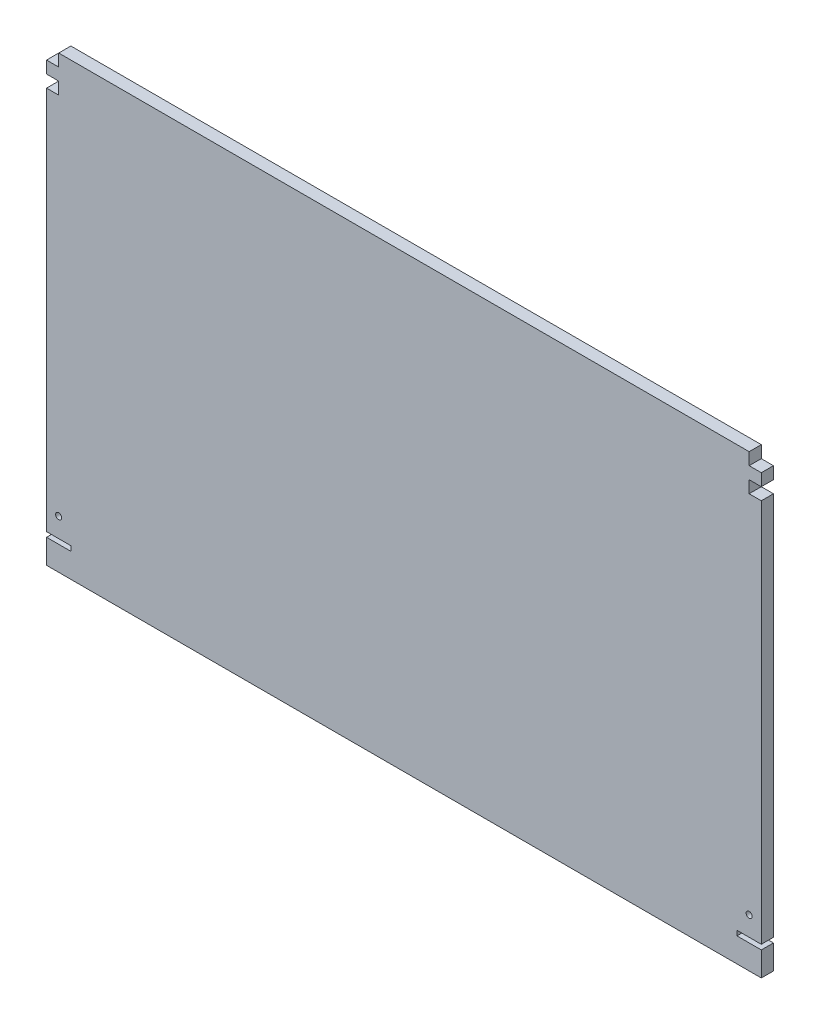
ISO-10303-21;
HEADER;
FILE_DESCRIPTION(('STEP AP214'),'2;1');
FILE_NAME('part.step','',(''),(''),'','','');
FILE_SCHEMA(('AUTOMOTIVE_DESIGN { 1 0 10303 214 1 1 1 1 }'));
ENDSEC;
DATA;
#1=APPLICATION_CONTEXT('core data for automotive mechanical design processes');
#2=APPLICATION_PROTOCOL_DEFINITION('international standard','automotive_design',2000,#1);
#3=PRODUCT_CONTEXT('',#1,'mechanical');
#4=PRODUCT('Part','Part','',(#3));
#5=PRODUCT_RELATED_PRODUCT_CATEGORY('part','',(#4));
#6=PRODUCT_DEFINITION_FORMATION('','',#4);
#7=PRODUCT_DEFINITION_CONTEXT('part definition',#1,'design');
#8=PRODUCT_DEFINITION('design','',#6,#7);
#9=PRODUCT_DEFINITION_SHAPE('','',#8);
#10=(LENGTH_UNIT() NAMED_UNIT(*) SI_UNIT(.MILLI.,.METRE.));
#11=(NAMED_UNIT(*) PLANE_ANGLE_UNIT() SI_UNIT($,.RADIAN.));
#12=(NAMED_UNIT(*) SI_UNIT($,.STERADIAN.) SOLID_ANGLE_UNIT());
#13=UNCERTAINTY_MEASURE_WITH_UNIT(LENGTH_MEASURE(1.E-05),#10,'distance_accuracy_value','');
#14=(GEOMETRIC_REPRESENTATION_CONTEXT(3) GLOBAL_UNCERTAINTY_ASSIGNED_CONTEXT((#13)) GLOBAL_UNIT_ASSIGNED_CONTEXT((#10,
#11,#12)) REPRESENTATION_CONTEXT('',''));
#15=CARTESIAN_POINT('',(0.,0.,0.));
#16=DIRECTION('',(0.,0.,1.));
#17=DIRECTION('',(1.,0.,0.));
#18=AXIS2_PLACEMENT_3D('',#15,#16,#17);
#19=CARTESIAN_POINT('',(-294.,0.,5.));
#20=DIRECTION('',(1.,0.,0.));
#21=DIRECTION('',(0.,0.,-1.));
#22=AXIS2_PLACEMENT_3D('',#19,#20,#21);
#23=PLANE('',#22);
#24=DIRECTION('',(0.,-1.,0.));
#25=VECTOR('',#24,1.);
#26=CARTESIAN_POINT('',(-294.,0.,5.));
#27=LINE('',#26,#25);
#28=CARTESIAN_POINT('',(-294.,-175.,5.));
#29=VERTEX_POINT('',#28);
#30=CARTESIAN_POINT('',(-294.,-185.,5.));
#31=VERTEX_POINT('',#30);
#32=EDGE_CURVE('E216',#29,#31,#27,.T.);
#33=ORIENTED_EDGE('',*,*,#32,.F.);
#34=DIRECTION('',(0.,0.,-1.));
#35=VECTOR('',#34,1.);
#36=CARTESIAN_POINT('',(-294.,-175.,5.));
#37=LINE('',#36,#35);
#38=CARTESIAN_POINT('',(-294.,-175.,0.));
#39=VERTEX_POINT('',#38);
#40=EDGE_CURVE('E266',#29,#39,#37,.T.);
#41=ORIENTED_EDGE('',*,*,#40,.T.);
#42=DIRECTION('',(0.,-1.,0.));
#43=VECTOR('',#42,1.);
#44=CARTESIAN_POINT('',(-294.,0.,0.));
#45=LINE('',#44,#43);
#46=CARTESIAN_POINT('',(-294.,-185.,0.));
#47=VERTEX_POINT('',#46);
#48=EDGE_CURVE('E308',#39,#47,#45,.T.);
#49=ORIENTED_EDGE('',*,*,#48,.T.);
#50=DIRECTION('',(0.,0.,-1.));
#51=VECTOR('',#50,1.);
#52=CARTESIAN_POINT('',(-294.,-185.,5.));
#53=LINE('',#52,#51);
#54=EDGE_CURVE('E370',#31,#47,#53,.T.);
#55=ORIENTED_EDGE('',*,*,#54,.F.);
#56=EDGE_LOOP('',(#33,#41,#49,#55));
#57=FACE_BOUND('',#56,.T.);
#58=ADVANCED_FACE('F32',(#57),#23,.F.);
#59=CARTESIAN_POINT('',(0.,0.,5.));
#60=DIRECTION('',(1.,0.,0.));
#61=DIRECTION('',(0.,0.,-1.));
#62=AXIS2_PLACEMENT_3D('',#59,#60,#61);
#63=PLANE('',#62);
#64=DIRECTION('',(0.,0.,-1.));
#65=VECTOR('',#64,1.);
#66=CARTESIAN_POINT('',(0.,-175.,5.));
#67=LINE('',#66,#65);
#68=CARTESIAN_POINT('',(0.,-175.,5.));
#69=VERTEX_POINT('',#68);
#70=CARTESIAN_POINT('',(0.,-175.,0.));
#71=VERTEX_POINT('',#70);
#72=EDGE_CURVE('E245',#69,#71,#67,.T.);
#73=ORIENTED_EDGE('',*,*,#72,.F.);
#74=DIRECTION('',(0.,-1.,0.));
#75=VECTOR('',#74,1.);
#76=CARTESIAN_POINT('',(0.,0.,5.));
#77=LINE('',#76,#75);
#78=CARTESIAN_POINT('',(0.,-185.,5.));
#79=VERTEX_POINT('',#78);
#80=EDGE_CURVE('E220',#69,#79,#77,.T.);
#81=ORIENTED_EDGE('',*,*,#80,.T.);
#82=DIRECTION('',(0.,0.,-1.));
#83=VECTOR('',#82,1.);
#84=CARTESIAN_POINT('',(0.,-185.,5.));
#85=LINE('',#84,#83);
#86=CARTESIAN_POINT('',(0.,-185.,0.));
#87=VERTEX_POINT('',#86);
#88=EDGE_CURVE('E372',#79,#87,#85,.T.);
#89=ORIENTED_EDGE('',*,*,#88,.T.);
#90=DIRECTION('',(0.,-1.,0.));
#91=VECTOR('',#90,1.);
#92=CARTESIAN_POINT('',(0.,0.,0.));
#93=LINE('',#92,#91);
#94=EDGE_CURVE('E382',#71,#87,#93,.T.);
#95=ORIENTED_EDGE('',*,*,#94,.F.);
#96=EDGE_LOOP('',(#73,#81,#89,#95));
#97=FACE_BOUND('',#96,.T.);
#98=ADVANCED_FACE('F425',(#97),#63,.T.);
#99=CARTESIAN_POINT('',(0.,-4.99999999999998,5.));
#100=DIRECTION('',(0.,1.,0.));
#101=DIRECTION('',(0.,0.,1.));
#102=AXIS2_PLACEMENT_3D('',#99,#100,#101);
#103=PLANE('',#102);
#104=DIRECTION('',(1.,0.,0.));
#105=VECTOR('',#104,1.);
#106=CARTESIAN_POINT('',(0.,-4.99999999999998,0.));
#107=LINE('',#106,#105);
#108=CARTESIAN_POINT('',(-294.,-4.99999999999998,0.));
#109=VERTEX_POINT('',#108);
#110=CARTESIAN_POINT('',(-289.,-4.99999999999998,0.));
#111=VERTEX_POINT('',#110);
#112=EDGE_CURVE('E269',#109,#111,#107,.T.);
#113=ORIENTED_EDGE('',*,*,#112,.F.);
#114=DIRECTION('',(0.,0.,-1.));
#115=VECTOR('',#114,1.);
#116=CARTESIAN_POINT('',(-294.,-4.99999999999998,5.));
#117=LINE('',#116,#115);
#118=CARTESIAN_POINT('',(-294.,-4.99999999999998,5.));
#119=VERTEX_POINT('',#118);
#120=EDGE_CURVE('E11',#119,#109,#117,.T.);
#121=ORIENTED_EDGE('',*,*,#120,.F.);
#122=DIRECTION('',(1.,0.,0.));
#123=VECTOR('',#122,1.);
#124=CARTESIAN_POINT('',(0.,-4.99999999999998,5.));
#125=LINE('',#124,#123);
#126=CARTESIAN_POINT('',(-289.,-4.99999999999998,5.));
#127=VERTEX_POINT('',#126);
#128=EDGE_CURVE('E225',#119,#127,#125,.T.);
#129=ORIENTED_EDGE('',*,*,#128,.T.);
#130=DIRECTION('',(0.,0.,-1.));
#131=VECTOR('',#130,1.);
#132=CARTESIAN_POINT('',(-289.,-4.99999999999998,5.));
#133=LINE('',#132,#131);
#134=EDGE_CURVE('E333',#127,#111,#133,.T.);
#135=ORIENTED_EDGE('',*,*,#134,.T.);
#136=EDGE_LOOP('',(#113,#121,#129,#135));
#137=FACE_BOUND('',#136,.T.);
#138=ADVANCED_FACE('F34',(#137),#103,.T.);
#139=CARTESIAN_POINT('',(-294.,-9.99999999999998,0.));
#140=VERTEX_POINT('',#139);
#141=EDGE_CURVE('E317',#109,#140,#45,.T.);
#142=ORIENTED_EDGE('',*,*,#141,.T.);
#143=DIRECTION('',(0.,0.,-1.));
#144=VECTOR('',#143,1.);
#145=CARTESIAN_POINT('',(-294.,-9.99999999999998,5.));
#146=LINE('',#145,#144);
#147=CARTESIAN_POINT('',(-294.,-9.99999999999998,5.));
#148=VERTEX_POINT('',#147);
#149=EDGE_CURVE('E40',#148,#140,#146,.T.);
#150=ORIENTED_EDGE('',*,*,#149,.F.);
#151=EDGE_CURVE('E218',#119,#148,#27,.T.);
#152=ORIENTED_EDGE('',*,*,#151,.F.);
#153=ORIENTED_EDGE('',*,*,#120,.T.);
#154=EDGE_LOOP('',(#142,#150,#152,#153));
#155=FACE_BOUND('',#154,.T.);
#156=ADVANCED_FACE('F447',(#155),#23,.F.);
#157=CARTESIAN_POINT('',(0.,-9.99999999999998,5.));
#158=DIRECTION('',(0.,1.,0.));
#159=DIRECTION('',(0.,0.,1.));
#160=AXIS2_PLACEMENT_3D('',#157,#158,#159);
#161=PLANE('',#160);
#162=DIRECTION('',(1.,0.,0.));
#163=VECTOR('',#162,1.);
#164=CARTESIAN_POINT('',(0.,-9.99999999999998,0.));
#165=LINE('',#164,#163);
#166=CARTESIAN_POINT('',(-289.,-9.99999999999998,0.));
#167=VERTEX_POINT('',#166);
#168=EDGE_CURVE('E323',#140,#167,#165,.T.);
#169=ORIENTED_EDGE('',*,*,#168,.T.);
#170=DIRECTION('',(0.,0.,-1.));
#171=VECTOR('',#170,1.);
#172=CARTESIAN_POINT('',(-289.,-9.99999999999998,5.));
#173=LINE('',#172,#171);
#174=CARTESIAN_POINT('',(-289.,-9.99999999999998,5.));
#175=VERTEX_POINT('',#174);
#176=EDGE_CURVE('E366',#175,#167,#173,.T.);
#177=ORIENTED_EDGE('',*,*,#176,.F.);
#178=DIRECTION('',(1.,0.,0.));
#179=VECTOR('',#178,1.);
#180=CARTESIAN_POINT('',(0.,-9.99999999999998,5.));
#181=LINE('',#180,#179);
#182=EDGE_CURVE('E224',#148,#175,#181,.T.);
#183=ORIENTED_EDGE('',*,*,#182,.F.);
#184=ORIENTED_EDGE('',*,*,#149,.T.);
#185=EDGE_LOOP('',(#169,#177,#183,#184));
#186=FACE_BOUND('',#185,.T.);
#187=ADVANCED_FACE('F378',(#186),#161,.F.);
#188=CARTESIAN_POINT('',(-289.,0.,5.));
#189=DIRECTION('',(1.,0.,0.));
#190=DIRECTION('',(0.,0.,-1.));
#191=AXIS2_PLACEMENT_3D('',#188,#189,#190);
#192=PLANE('',#191);
#193=DIRECTION('',(0.,-1.,0.));
#194=VECTOR('',#193,1.);
#195=CARTESIAN_POINT('',(-289.,0.,0.));
#196=LINE('',#195,#194);
#197=CARTESIAN_POINT('',(-289.,-15.,0.));
#198=VERTEX_POINT('',#197);
#199=EDGE_CURVE('E319',#167,#198,#196,.T.);
#200=ORIENTED_EDGE('',*,*,#199,.T.);
#201=DIRECTION('',(0.,0.,-1.));
#202=VECTOR('',#201,1.);
#203=CARTESIAN_POINT('',(-289.,-15.,5.));
#204=LINE('',#203,#202);
#205=CARTESIAN_POINT('',(-289.,-15.,5.));
#206=VERTEX_POINT('',#205);
#207=EDGE_CURVE('E361',#206,#198,#204,.T.);
#208=ORIENTED_EDGE('',*,*,#207,.F.);
#209=DIRECTION('',(0.,-1.,0.));
#210=VECTOR('',#209,1.);
#211=CARTESIAN_POINT('',(-289.,0.,5.));
#212=LINE('',#211,#210);
#213=EDGE_CURVE('E229',#175,#206,#212,.T.);
#214=ORIENTED_EDGE('',*,*,#213,.F.);
#215=ORIENTED_EDGE('',*,*,#176,.T.);
#216=EDGE_LOOP('',(#200,#208,#214,#215));
#217=FACE_BOUND('',#216,.T.);
#218=ADVANCED_FACE('F362',(#217),#192,.F.);
#219=CARTESIAN_POINT('',(0.,-15.,5.));
#220=DIRECTION('',(0.,1.,0.));
#221=DIRECTION('',(0.,0.,1.));
#222=AXIS2_PLACEMENT_3D('',#219,#220,#221);
#223=PLANE('',#222);
#224=DIRECTION('',(1.,0.,0.));
#225=VECTOR('',#224,1.);
#226=CARTESIAN_POINT('',(0.,-15.,0.));
#227=LINE('',#226,#225);
#228=CARTESIAN_POINT('',(-294.,-15.,0.));
#229=VERTEX_POINT('',#228);
#230=EDGE_CURVE('E315',#229,#198,#227,.T.);
#231=ORIENTED_EDGE('',*,*,#230,.F.);
#232=DIRECTION('',(0.,0.,-1.));
#233=VECTOR('',#232,1.);
#234=CARTESIAN_POINT('',(-294.,-15.,5.));
#235=LINE('',#234,#233);
#236=CARTESIAN_POINT('',(-294.,-15.,5.));
#237=VERTEX_POINT('',#236);
#238=EDGE_CURVE('E367',#237,#229,#235,.T.);
#239=ORIENTED_EDGE('',*,*,#238,.F.);
#240=DIRECTION('',(1.,0.,0.));
#241=VECTOR('',#240,1.);
#242=CARTESIAN_POINT('',(0.,-15.,5.));
#243=LINE('',#242,#241);
#244=EDGE_CURVE('E214',#237,#206,#243,.T.);
#245=ORIENTED_EDGE('',*,*,#244,.T.);
#246=ORIENTED_EDGE('',*,*,#207,.T.);
#247=EDGE_LOOP('',(#231,#239,#245,#246));
#248=FACE_BOUND('',#247,.T.);
#249=ADVANCED_FACE('F369',(#248),#223,.T.);
#250=CARTESIAN_POINT('',(-294.,-173.,0.));
#251=VERTEX_POINT('',#250);
#252=EDGE_CURVE('E208',#229,#251,#45,.T.);
#253=ORIENTED_EDGE('',*,*,#252,.T.);
#254=DIRECTION('',(0.,0.,-1.));
#255=VECTOR('',#254,1.);
#256=CARTESIAN_POINT('',(-294.,-173.,5.));
#257=LINE('',#256,#255);
#258=CARTESIAN_POINT('',(-294.,-173.,5.));
#259=VERTEX_POINT('',#258);
#260=EDGE_CURVE('E55',#259,#251,#257,.T.);
#261=ORIENTED_EDGE('',*,*,#260,.F.);
#262=EDGE_CURVE('E205',#237,#259,#27,.T.);
#263=ORIENTED_EDGE('',*,*,#262,.F.);
#264=ORIENTED_EDGE('',*,*,#238,.T.);
#265=EDGE_LOOP('',(#253,#261,#263,#264));
#266=FACE_BOUND('',#265,.T.);
#267=ADVANCED_FACE('F204',(#266),#23,.F.);
#268=CARTESIAN_POINT('',(0.,-185.,5.));
#269=DIRECTION('',(0.,-1.,0.));
#270=DIRECTION('',(0.,0.,-1.));
#271=AXIS2_PLACEMENT_3D('',#268,#269,#270);
#272=PLANE('',#271);
#273=DIRECTION('',(-1.,0.,0.));
#274=VECTOR('',#273,1.);
#275=CARTESIAN_POINT('',(0.,-185.,0.));
#276=LINE('',#275,#274);
#277=EDGE_CURVE('E311',#87,#47,#276,.T.);
#278=ORIENTED_EDGE('',*,*,#277,.F.);
#279=ORIENTED_EDGE('',*,*,#88,.F.);
#280=DIRECTION('',(-1.,0.,0.));
#281=VECTOR('',#280,1.);
#282=CARTESIAN_POINT('',(0.,-185.,5.));
#283=LINE('',#282,#281);
#284=EDGE_CURVE('E215',#79,#31,#283,.T.);
#285=ORIENTED_EDGE('',*,*,#284,.T.);
#286=ORIENTED_EDGE('',*,*,#54,.T.);
#287=EDGE_LOOP('',(#278,#279,#285,#286));
#288=FACE_BOUND('',#287,.T.);
#289=ADVANCED_FACE('F429',(#288),#272,.T.);
#290=DIRECTION('',(0.,0.,-1.));
#291=VECTOR('',#290,1.);
#292=CARTESIAN_POINT('',(0.,-173.,5.));
#293=LINE('',#292,#291);
#294=CARTESIAN_POINT('',(0.,-173.,5.));
#295=VERTEX_POINT('',#294);
#296=CARTESIAN_POINT('',(0.,-173.,0.));
#297=VERTEX_POINT('',#296);
#298=EDGE_CURVE('E242',#295,#297,#293,.T.);
#299=ORIENTED_EDGE('',*,*,#298,.T.);
#300=CARTESIAN_POINT('',(0.,-15.,0.));
#301=VERTEX_POINT('',#300);
#302=EDGE_CURVE('E383',#301,#297,#93,.T.);
#303=ORIENTED_EDGE('',*,*,#302,.F.);
#304=DIRECTION('',(0.,0.,-1.));
#305=VECTOR('',#304,1.);
#306=CARTESIAN_POINT('',(0.,-15.,5.));
#307=LINE('',#306,#305);
#308=CARTESIAN_POINT('',(0.,-15.,5.));
#309=VERTEX_POINT('',#308);
#310=EDGE_CURVE('E419',#309,#301,#307,.T.);
#311=ORIENTED_EDGE('',*,*,#310,.F.);
#312=EDGE_CURVE('E350',#309,#295,#77,.T.);
#313=ORIENTED_EDGE('',*,*,#312,.T.);
#314=EDGE_LOOP('',(#299,#303,#311,#313));
#315=FACE_BOUND('',#314,.T.);
#316=ADVANCED_FACE('F452',(#315),#63,.T.);
#317=CARTESIAN_POINT('',(0.,-15.,5.));
#318=DIRECTION('',(0.,-1.,0.));
#319=DIRECTION('',(0.,0.,-1.));
#320=AXIS2_PLACEMENT_3D('',#317,#318,#319);
#321=PLANE('',#320);
#322=DIRECTION('',(-1.,0.,0.));
#323=VECTOR('',#322,1.);
#324=CARTESIAN_POINT('',(0.,-15.,0.));
#325=LINE('',#324,#323);
#326=CARTESIAN_POINT('',(-5.,-15.,0.));
#327=VERTEX_POINT('',#326);
#328=EDGE_CURVE('E386',#301,#327,#325,.T.);
#329=ORIENTED_EDGE('',*,*,#328,.T.);
#330=DIRECTION('',(0.,0.,-1.));
#331=VECTOR('',#330,1.);
#332=CARTESIAN_POINT('',(-5.,-15.,5.));
#333=LINE('',#332,#331);
#334=CARTESIAN_POINT('',(-5.,-15.,5.));
#335=VERTEX_POINT('',#334);
#336=EDGE_CURVE('E417',#335,#327,#333,.T.);
#337=ORIENTED_EDGE('',*,*,#336,.F.);
#338=DIRECTION('',(-1.,0.,0.));
#339=VECTOR('',#338,1.);
#340=CARTESIAN_POINT('',(0.,-15.,5.));
#341=LINE('',#340,#339);
#342=EDGE_CURVE('E348',#309,#335,#341,.T.);
#343=ORIENTED_EDGE('',*,*,#342,.F.);
#344=ORIENTED_EDGE('',*,*,#310,.T.);
#345=EDGE_LOOP('',(#329,#337,#343,#344));
#346=FACE_BOUND('',#345,.T.);
#347=ADVANCED_FACE('F494',(#346),#321,.F.);
#348=CARTESIAN_POINT('',(-5.,0.,5.));
#349=DIRECTION('',(1.,0.,0.));
#350=DIRECTION('',(0.,1.,0.));
#351=AXIS2_PLACEMENT_3D('',#348,#349,#350);
#352=PLANE('',#351);
#353=DIRECTION('',(0.,-1.,0.));
#354=VECTOR('',#353,1.);
#355=CARTESIAN_POINT('',(-5.,0.,0.));
#356=LINE('',#355,#354);
#357=CARTESIAN_POINT('',(-5.,-9.99999999999998,0.));
#358=VERTEX_POINT('',#357);
#359=EDGE_CURVE('E390',#358,#327,#356,.T.);
#360=ORIENTED_EDGE('',*,*,#359,.F.);
#361=DIRECTION('',(0.,0.,-1.));
#362=VECTOR('',#361,1.);
#363=CARTESIAN_POINT('',(-5.,-9.99999999999998,5.));
#364=LINE('',#363,#362);
#365=CARTESIAN_POINT('',(-5.,-9.99999999999998,5.));
#366=VERTEX_POINT('',#365);
#367=EDGE_CURVE('E415',#366,#358,#364,.T.);
#368=ORIENTED_EDGE('',*,*,#367,.F.);
#369=DIRECTION('',(0.,-1.,0.));
#370=VECTOR('',#369,1.);
#371=CARTESIAN_POINT('',(-5.,0.,5.));
#372=LINE('',#371,#370);
#373=EDGE_CURVE('E345',#366,#335,#372,.T.);
#374=ORIENTED_EDGE('',*,*,#373,.T.);
#375=ORIENTED_EDGE('',*,*,#336,.T.);
#376=EDGE_LOOP('',(#360,#368,#374,#375));
#377=FACE_BOUND('',#376,.T.);
#378=ADVANCED_FACE('F499',(#377),#352,.T.);
#379=CARTESIAN_POINT('',(0.,-9.99999999999998,5.));
#380=DIRECTION('',(0.,-1.,0.));
#381=DIRECTION('',(0.,0.,-1.));
#382=AXIS2_PLACEMENT_3D('',#379,#380,#381);
#383=PLANE('',#382);
#384=DIRECTION('',(-1.,0.,0.));
#385=VECTOR('',#384,1.);
#386=CARTESIAN_POINT('',(0.,-9.99999999999998,0.));
#387=LINE('',#386,#385);
#388=CARTESIAN_POINT('',(0.,-9.99999999999998,0.));
#389=VERTEX_POINT('',#388);
#390=EDGE_CURVE('E393',#389,#358,#387,.T.);
#391=ORIENTED_EDGE('',*,*,#390,.F.);
#392=DIRECTION('',(0.,0.,-1.));
#393=VECTOR('',#392,1.);
#394=CARTESIAN_POINT('',(0.,-9.99999999999998,5.));
#395=LINE('',#394,#393);
#396=CARTESIAN_POINT('',(0.,-9.99999999999998,5.));
#397=VERTEX_POINT('',#396);
#398=EDGE_CURVE('E413',#397,#389,#395,.T.);
#399=ORIENTED_EDGE('',*,*,#398,.F.);
#400=DIRECTION('',(-1.,0.,0.));
#401=VECTOR('',#400,1.);
#402=CARTESIAN_POINT('',(0.,-9.99999999999998,5.));
#403=LINE('',#402,#401);
#404=EDGE_CURVE('E342',#397,#366,#403,.T.);
#405=ORIENTED_EDGE('',*,*,#404,.T.);
#406=ORIENTED_EDGE('',*,*,#367,.T.);
#407=EDGE_LOOP('',(#391,#399,#405,#406));
#408=FACE_BOUND('',#407,.T.);
#409=ADVANCED_FACE('F509',(#408),#383,.T.);
#410=CARTESIAN_POINT('',(0.,-4.99999999999998,0.));
#411=VERTEX_POINT('',#410);
#412=EDGE_CURVE('E387',#411,#389,#93,.T.);
#413=ORIENTED_EDGE('',*,*,#412,.F.);
#414=DIRECTION('',(0.,0.,-1.));
#415=VECTOR('',#414,1.);
#416=CARTESIAN_POINT('',(0.,-4.99999999999998,5.));
#417=LINE('',#416,#415);
#418=CARTESIAN_POINT('',(0.,-4.99999999999998,5.));
#419=VERTEX_POINT('',#418);
#420=EDGE_CURVE('E411',#419,#411,#417,.T.);
#421=ORIENTED_EDGE('',*,*,#420,.F.);
#422=EDGE_CURVE('E341',#419,#397,#77,.T.);
#423=ORIENTED_EDGE('',*,*,#422,.T.);
#424=ORIENTED_EDGE('',*,*,#398,.T.);
#425=EDGE_LOOP('',(#413,#421,#423,#424));
#426=FACE_BOUND('',#425,.T.);
#427=ADVANCED_FACE('F453',(#426),#63,.T.);
#428=CARTESIAN_POINT('',(0.,-4.99999999999998,5.));
#429=DIRECTION('',(0.,-1.,0.));
#430=DIRECTION('',(0.,0.,-1.));
#431=AXIS2_PLACEMENT_3D('',#428,#429,#430);
#432=PLANE('',#431);
#433=DIRECTION('',(-1.,0.,0.));
#434=VECTOR('',#433,1.);
#435=CARTESIAN_POINT('',(0.,-4.99999999999998,0.));
#436=LINE('',#435,#434);
#437=CARTESIAN_POINT('',(-5.00000000000002,-4.99999999999998,0.));
#438=VERTEX_POINT('',#437);
#439=EDGE_CURVE('E396',#411,#438,#436,.T.);
#440=ORIENTED_EDGE('',*,*,#439,.T.);
#441=DIRECTION('',(0.,0.,-1.));
#442=VECTOR('',#441,1.);
#443=CARTESIAN_POINT('',(-5.00000000000002,-4.99999999999998,5.));
#444=LINE('',#443,#442);
#445=CARTESIAN_POINT('',(-5.00000000000002,-4.99999999999998,5.));
#446=VERTEX_POINT('',#445);
#447=EDGE_CURVE('E409',#446,#438,#444,.T.);
#448=ORIENTED_EDGE('',*,*,#447,.F.);
#449=DIRECTION('',(-1.,0.,0.));
#450=VECTOR('',#449,1.);
#451=CARTESIAN_POINT('',(0.,-4.99999999999998,5.));
#452=LINE('',#451,#450);
#453=EDGE_CURVE('E339',#419,#446,#452,.T.);
#454=ORIENTED_EDGE('',*,*,#453,.F.);
#455=ORIENTED_EDGE('',*,*,#420,.T.);
#456=EDGE_LOOP('',(#440,#448,#454,#455));
#457=FACE_BOUND('',#456,.T.);
#458=ADVANCED_FACE('F528',(#457),#432,.F.);
#459=CARTESIAN_POINT('',(-5.00000000000002,0.,5.));
#460=DIRECTION('',(1.,0.,0.));
#461=DIRECTION('',(0.,1.,0.));
#462=AXIS2_PLACEMENT_3D('',#459,#460,#461);
#463=PLANE('',#462);
#464=DIRECTION('',(0.,-1.,0.));
#465=VECTOR('',#464,1.);
#466=CARTESIAN_POINT('',(-5.00000000000002,0.,0.));
#467=LINE('',#466,#465);
#468=CARTESIAN_POINT('',(-5.00000000000002,0.,0.));
#469=VERTEX_POINT('',#468);
#470=EDGE_CURVE('E399',#469,#438,#467,.T.);
#471=ORIENTED_EDGE('',*,*,#470,.F.);
#472=DIRECTION('',(0.,0.,-1.));
#473=VECTOR('',#472,1.);
#474=CARTESIAN_POINT('',(-5.00000000000002,0.,5.));
#475=LINE('',#474,#473);
#476=CARTESIAN_POINT('',(-5.00000000000002,0.,5.));
#477=VERTEX_POINT('',#476);
#478=EDGE_CURVE('E407',#477,#469,#475,.T.);
#479=ORIENTED_EDGE('',*,*,#478,.F.);
#480=DIRECTION('',(0.,-1.,0.));
#481=VECTOR('',#480,1.);
#482=CARTESIAN_POINT('',(-5.00000000000002,0.,5.));
#483=LINE('',#482,#481);
#484=EDGE_CURVE('E336',#477,#446,#483,.T.);
#485=ORIENTED_EDGE('',*,*,#484,.T.);
#486=ORIENTED_EDGE('',*,*,#447,.T.);
#487=EDGE_LOOP('',(#471,#479,#485,#486));
#488=FACE_BOUND('',#487,.T.);
#489=ADVANCED_FACE('F537',(#488),#463,.T.);
#490=CARTESIAN_POINT('',(0.,0.,5.));
#491=DIRECTION('',(0.,-1.,0.));
#492=DIRECTION('',(1.,0.,0.));
#493=AXIS2_PLACEMENT_3D('',#490,#491,#492);
#494=PLANE('',#493);
#495=DIRECTION('',(-1.,0.,0.));
#496=VECTOR('',#495,1.);
#497=CARTESIAN_POINT('',(0.,0.,0.));
#498=LINE('',#497,#496);
#499=CARTESIAN_POINT('',(-289.,0.,0.));
#500=VERTEX_POINT('',#499);
#501=EDGE_CURVE('E234',#469,#500,#498,.T.);
#502=ORIENTED_EDGE('',*,*,#501,.T.);
#503=DIRECTION('',(0.,0.,-1.));
#504=VECTOR('',#503,1.);
#505=CARTESIAN_POINT('',(-289.,0.,5.));
#506=LINE('',#505,#504);
#507=CARTESIAN_POINT('',(-289.,0.,5.));
#508=VERTEX_POINT('',#507);
#509=EDGE_CURVE('E404',#508,#500,#506,.T.);
#510=ORIENTED_EDGE('',*,*,#509,.F.);
#511=DIRECTION('',(-1.,0.,0.));
#512=VECTOR('',#511,1.);
#513=CARTESIAN_POINT('',(0.,0.,5.));
#514=LINE('',#513,#512);
#515=EDGE_CURVE('E334',#477,#508,#514,.T.);
#516=ORIENTED_EDGE('',*,*,#515,.F.);
#517=ORIENTED_EDGE('',*,*,#478,.T.);
#518=EDGE_LOOP('',(#502,#510,#516,#517));
#519=FACE_BOUND('',#518,.T.);
#520=ADVANCED_FACE('F547',(#519),#494,.F.);
#521=CARTESIAN_POINT('',(-289.,0.,5.));
#522=DIRECTION('',(1.,0.,0.));
#523=DIRECTION('',(0.,0.,-1.));
#524=AXIS2_PLACEMENT_3D('',#521,#522,#523);
#525=PLANE('',#524);
#526=DIRECTION('',(0.,-1.,0.));
#527=VECTOR('',#526,1.);
#528=CARTESIAN_POINT('',(-289.,0.,0.));
#529=LINE('',#528,#527);
#530=EDGE_CURVE('E231',#500,#111,#529,.T.);
#531=ORIENTED_EDGE('',*,*,#530,.T.);
#532=ORIENTED_EDGE('',*,*,#134,.F.);
#533=DIRECTION('',(0.,-1.,0.));
#534=VECTOR('',#533,1.);
#535=CARTESIAN_POINT('',(-289.,0.,5.));
#536=LINE('',#535,#534);
#537=EDGE_CURVE('E331',#508,#127,#536,.T.);
#538=ORIENTED_EDGE('',*,*,#537,.F.);
#539=ORIENTED_EDGE('',*,*,#509,.T.);
#540=EDGE_LOOP('',(#531,#532,#538,#539));
#541=FACE_BOUND('',#540,.T.);
#542=ADVANCED_FACE('F557',(#541),#525,.F.);
#543=CARTESIAN_POINT('',(0.,0.,5.));
#544=DIRECTION('',(0.,0.,1.));
#545=DIRECTION('',(1.,0.,0.));
#546=AXIS2_PLACEMENT_3D('',#543,#544,#545);
#547=PLANE('',#546);
#548=CARTESIAN_POINT('',(-289.,-165.,5.));
#549=DIRECTION('',(0.,0.,-1.));
#550=DIRECTION('',(-1.,0.,0.));
#551=AXIS2_PLACEMENT_3D('',#548,#549,#550);
#552=CIRCLE('',#551,1.24999999999996);
#553=CARTESIAN_POINT('',(-290.25,-165.,5.));
#554=VERTEX_POINT('',#553);
#555=EDGE_CURVE('E255',#554,#554,#552,.T.);
#556=ORIENTED_EDGE('',*,*,#555,.T.);
#557=EDGE_LOOP('',(#556));
#558=FACE_BOUND('',#557,.T.);
#559=CARTESIAN_POINT('',(-5.,-165.,5.));
#560=DIRECTION('',(0.,0.,-1.));
#561=DIRECTION('',(1.,0.,0.));
#562=AXIS2_PLACEMENT_3D('',#559,#560,#561);
#563=CIRCLE('',#562,1.24999999999996);
#564=CARTESIAN_POINT('',(-3.75000000000005,-165.,5.));
#565=VERTEX_POINT('',#564);
#566=EDGE_CURVE('E280',#565,#565,#563,.T.);
#567=ORIENTED_EDGE('',*,*,#566,.T.);
#568=EDGE_LOOP('',(#567));
#569=FACE_BOUND('',#568,.T.);
#570=DIRECTION('',(-1.,0.,0.));
#571=VECTOR('',#570,1.);
#572=CARTESIAN_POINT('',(-294.,-175.,5.));
#573=LINE('',#572,#571);
#574=CARTESIAN_POINT('',(-284.,-175.,5.));
#575=VERTEX_POINT('',#574);
#576=EDGE_CURVE('E209',#575,#29,#573,.T.);
#577=ORIENTED_EDGE('',*,*,#576,.T.);
#578=ORIENTED_EDGE('',*,*,#32,.T.);
#579=ORIENTED_EDGE('',*,*,#284,.F.);
#580=ORIENTED_EDGE('',*,*,#80,.F.);
#581=DIRECTION('',(-1.,0.,0.));
#582=VECTOR('',#581,1.);
#583=CARTESIAN_POINT('',(0.,-175.,5.));
#584=LINE('',#583,#582);
#585=CARTESIAN_POINT('',(-10.,-175.,5.));
#586=VERTEX_POINT('',#585);
#587=EDGE_CURVE('E250',#69,#586,#584,.T.);
#588=ORIENTED_EDGE('',*,*,#587,.T.);
#589=DIRECTION('',(0.,1.,0.));
#590=VECTOR('',#589,1.);
#591=CARTESIAN_POINT('',(-10.,-175.,5.));
#592=LINE('',#591,#590);
#593=CARTESIAN_POINT('',(-10.,-173.,5.));
#594=VERTEX_POINT('',#593);
#595=EDGE_CURVE('E258',#586,#594,#592,.T.);
#596=ORIENTED_EDGE('',*,*,#595,.T.);
#597=DIRECTION('',(1.,0.,0.));
#598=VECTOR('',#597,1.);
#599=CARTESIAN_POINT('',(0.,-173.,5.));
#600=LINE('',#599,#598);
#601=EDGE_CURVE('E240',#594,#295,#600,.T.);
#602=ORIENTED_EDGE('',*,*,#601,.T.);
#603=ORIENTED_EDGE('',*,*,#312,.F.);
#604=ORIENTED_EDGE('',*,*,#342,.T.);
#605=ORIENTED_EDGE('',*,*,#373,.F.);
#606=ORIENTED_EDGE('',*,*,#404,.F.);
#607=ORIENTED_EDGE('',*,*,#422,.F.);
#608=ORIENTED_EDGE('',*,*,#453,.T.);
#609=ORIENTED_EDGE('',*,*,#484,.F.);
#610=ORIENTED_EDGE('',*,*,#515,.T.);
#611=ORIENTED_EDGE('',*,*,#537,.T.);
#612=ORIENTED_EDGE('',*,*,#128,.F.);
#613=ORIENTED_EDGE('',*,*,#151,.T.);
#614=ORIENTED_EDGE('',*,*,#182,.T.);
#615=ORIENTED_EDGE('',*,*,#213,.T.);
#616=ORIENTED_EDGE('',*,*,#244,.F.);
#617=ORIENTED_EDGE('',*,*,#262,.T.);
#618=DIRECTION('',(1.,0.,0.));
#619=VECTOR('',#618,1.);
#620=CARTESIAN_POINT('',(-294.,-173.,5.));
#621=LINE('',#620,#619);
#622=CARTESIAN_POINT('',(-284.,-173.,5.));
#623=VERTEX_POINT('',#622);
#624=EDGE_CURVE('E191',#259,#623,#621,.T.);
#625=ORIENTED_EDGE('',*,*,#624,.T.);
#626=DIRECTION('',(0.,-1.,0.));
#627=VECTOR('',#626,1.);
#628=CARTESIAN_POINT('',(-284.,-175.,5.));
#629=LINE('',#628,#627);
#630=EDGE_CURVE('E198',#623,#575,#629,.T.);
#631=ORIENTED_EDGE('',*,*,#630,.T.);
#632=EDGE_LOOP('',(#577,#578,#579,#580,#588,#596,#602,#603,#604,#605,#606,#607,#608,#609,#610,
#611,#612,#613,#614,#615,#616,#617,#625,#631));
#633=FACE_BOUND('',#632,.T.);
#634=ADVANCED_FACE('F212',(#558,#569,#633),#547,.T.);
#635=CARTESIAN_POINT('',(0.,0.,0.));
#636=DIRECTION('',(0.,0.,1.));
#637=DIRECTION('',(1.,0.,0.));
#638=AXIS2_PLACEMENT_3D('',#635,#636,#637);
#639=PLANE('',#638);
#640=CARTESIAN_POINT('',(-289.,-165.,0.));
#641=DIRECTION('',(0.,0.,-1.));
#642=DIRECTION('',(-1.,0.,0.));
#643=AXIS2_PLACEMENT_3D('',#640,#641,#642);
#644=CIRCLE('',#643,1.24999999999996);
#645=CARTESIAN_POINT('',(-290.25,-165.,0.));
#646=VERTEX_POINT('',#645);
#647=EDGE_CURVE('E283',#646,#646,#644,.T.);
#648=ORIENTED_EDGE('',*,*,#647,.F.);
#649=EDGE_LOOP('',(#648));
#650=FACE_BOUND('',#649,.T.);
#651=CARTESIAN_POINT('',(-5.,-165.,0.));
#652=DIRECTION('',(0.,0.,-1.));
#653=DIRECTION('',(1.,0.,0.));
#654=AXIS2_PLACEMENT_3D('',#651,#652,#653);
#655=CIRCLE('',#654,1.24999999999996);
#656=CARTESIAN_POINT('',(-3.75000000000005,-165.,0.));
#657=VERTEX_POINT('',#656);
#658=EDGE_CURVE('E277',#657,#657,#655,.T.);
#659=ORIENTED_EDGE('',*,*,#658,.F.);
#660=EDGE_LOOP('',(#659));
#661=FACE_BOUND('',#660,.T.);
#662=ORIENTED_EDGE('',*,*,#48,.F.);
#663=DIRECTION('',(-1.,0.,0.));
#664=VECTOR('',#663,1.);
#665=CARTESIAN_POINT('',(-294.,-175.,0.));
#666=LINE('',#665,#664);
#667=CARTESIAN_POINT('',(-284.,-175.,0.));
#668=VERTEX_POINT('',#667);
#669=EDGE_CURVE('E199',#668,#39,#666,.T.);
#670=ORIENTED_EDGE('',*,*,#669,.F.);
#671=DIRECTION('',(0.,-1.,0.));
#672=VECTOR('',#671,1.);
#673=CARTESIAN_POINT('',(-284.,-175.,0.));
#674=LINE('',#673,#672);
#675=CARTESIAN_POINT('',(-284.,-173.,0.));
#676=VERTEX_POINT('',#675);
#677=EDGE_CURVE('E271',#676,#668,#674,.T.);
#678=ORIENTED_EDGE('',*,*,#677,.F.);
#679=DIRECTION('',(1.,0.,0.));
#680=VECTOR('',#679,1.);
#681=CARTESIAN_POINT('',(-294.,-173.,0.));
#682=LINE('',#681,#680);
#683=EDGE_CURVE('E247',#251,#676,#682,.T.);
#684=ORIENTED_EDGE('',*,*,#683,.F.);
#685=ORIENTED_EDGE('',*,*,#252,.F.);
#686=ORIENTED_EDGE('',*,*,#230,.T.);
#687=ORIENTED_EDGE('',*,*,#199,.F.);
#688=ORIENTED_EDGE('',*,*,#168,.F.);
#689=ORIENTED_EDGE('',*,*,#141,.F.);
#690=ORIENTED_EDGE('',*,*,#112,.T.);
#691=ORIENTED_EDGE('',*,*,#530,.F.);
#692=ORIENTED_EDGE('',*,*,#501,.F.);
#693=ORIENTED_EDGE('',*,*,#470,.T.);
#694=ORIENTED_EDGE('',*,*,#439,.F.);
#695=ORIENTED_EDGE('',*,*,#412,.T.);
#696=ORIENTED_EDGE('',*,*,#390,.T.);
#697=ORIENTED_EDGE('',*,*,#359,.T.);
#698=ORIENTED_EDGE('',*,*,#328,.F.);
#699=ORIENTED_EDGE('',*,*,#302,.T.);
#700=DIRECTION('',(1.,0.,0.));
#701=VECTOR('',#700,1.);
#702=CARTESIAN_POINT('',(0.,-173.,0.));
#703=LINE('',#702,#701);
#704=CARTESIAN_POINT('',(-10.,-173.,0.));
#705=VERTEX_POINT('',#704);
#706=EDGE_CURVE('E248',#705,#297,#703,.T.);
#707=ORIENTED_EDGE('',*,*,#706,.F.);
#708=DIRECTION('',(0.,1.,0.));
#709=VECTOR('',#708,1.);
#710=CARTESIAN_POINT('',(-10.,-175.,0.));
#711=LINE('',#710,#709);
#712=CARTESIAN_POINT('',(-10.,-175.,0.));
#713=VERTEX_POINT('',#712);
#714=EDGE_CURVE('E251',#713,#705,#711,.T.);
#715=ORIENTED_EDGE('',*,*,#714,.F.);
#716=DIRECTION('',(-1.,0.,0.));
#717=VECTOR('',#716,1.);
#718=CARTESIAN_POINT('',(0.,-175.,0.));
#719=LINE('',#718,#717);
#720=EDGE_CURVE('E47',#71,#713,#719,.T.);
#721=ORIENTED_EDGE('',*,*,#720,.F.);
#722=ORIENTED_EDGE('',*,*,#94,.T.);
#723=ORIENTED_EDGE('',*,*,#277,.T.);
#724=EDGE_LOOP('',(#662,#670,#678,#684,#685,#686,#687,#688,#689,#690,#691,#692,#693,#694,#695,
#696,#697,#698,#699,#707,#715,#721,#722,#723));
#725=FACE_BOUND('',#724,.T.);
#726=ADVANCED_FACE('F298',(#650,#661,#725),#639,.F.);
#727=CARTESIAN_POINT('',(0.,-175.,5.));
#728=DIRECTION('',(0.,-1.,0.));
#729=DIRECTION('',(1.,0.,0.));
#730=AXIS2_PLACEMENT_3D('',#727,#728,#729);
#731=PLANE('',#730);
#732=ORIENTED_EDGE('',*,*,#720,.T.);
#733=DIRECTION('',(0.,0.,-1.));
#734=VECTOR('',#733,1.);
#735=CARTESIAN_POINT('',(-10.,-175.,5.));
#736=LINE('',#735,#734);
#737=EDGE_CURVE('E237',#586,#713,#736,.T.);
#738=ORIENTED_EDGE('',*,*,#737,.F.);
#739=ORIENTED_EDGE('',*,*,#587,.F.);
#740=ORIENTED_EDGE('',*,*,#72,.T.);
#741=EDGE_LOOP('',(#732,#738,#739,#740));
#742=FACE_BOUND('',#741,.T.);
#743=ADVANCED_FACE('F301',(#742),#731,.F.);
#744=CARTESIAN_POINT('',(0.,-173.,5.));
#745=DIRECTION('',(0.,1.,0.));
#746=DIRECTION('',(0.,0.,1.));
#747=AXIS2_PLACEMENT_3D('',#744,#745,#746);
#748=PLANE('',#747);
#749=ORIENTED_EDGE('',*,*,#706,.T.);
#750=ORIENTED_EDGE('',*,*,#298,.F.);
#751=ORIENTED_EDGE('',*,*,#601,.F.);
#752=DIRECTION('',(0.,0.,-1.));
#753=VECTOR('',#752,1.);
#754=CARTESIAN_POINT('',(-10.,-173.,5.));
#755=LINE('',#754,#753);
#756=EDGE_CURVE('E239',#594,#705,#755,.T.);
#757=ORIENTED_EDGE('',*,*,#756,.T.);
#758=EDGE_LOOP('',(#749,#750,#751,#757));
#759=FACE_BOUND('',#758,.T.);
#760=ADVANCED_FACE('F598',(#759),#748,.F.);
#761=CARTESIAN_POINT('',(-10.,-175.,5.));
#762=DIRECTION('',(-1.,0.,0.));
#763=DIRECTION('',(0.,0.,1.));
#764=AXIS2_PLACEMENT_3D('',#761,#762,#763);
#765=PLANE('',#764);
#766=ORIENTED_EDGE('',*,*,#714,.T.);
#767=ORIENTED_EDGE('',*,*,#756,.F.);
#768=ORIENTED_EDGE('',*,*,#595,.F.);
#769=ORIENTED_EDGE('',*,*,#737,.T.);
#770=EDGE_LOOP('',(#766,#767,#768,#769));
#771=FACE_BOUND('',#770,.T.);
#772=ADVANCED_FACE('F443',(#771),#765,.F.);
#773=CARTESIAN_POINT('',(-294.,-175.,5.));
#774=DIRECTION('',(0.,-1.,0.));
#775=DIRECTION('',(1.,0.,0.));
#776=AXIS2_PLACEMENT_3D('',#773,#774,#775);
#777=PLANE('',#776);
#778=ORIENTED_EDGE('',*,*,#669,.T.);
#779=ORIENTED_EDGE('',*,*,#40,.F.);
#780=ORIENTED_EDGE('',*,*,#576,.F.);
#781=DIRECTION('',(0.,0.,-1.));
#782=VECTOR('',#781,1.);
#783=CARTESIAN_POINT('',(-284.,-175.,5.));
#784=LINE('',#783,#782);
#785=EDGE_CURVE('E264',#575,#668,#784,.T.);
#786=ORIENTED_EDGE('',*,*,#785,.T.);
#787=EDGE_LOOP('',(#778,#779,#780,#786));
#788=FACE_BOUND('',#787,.T.);
#789=ADVANCED_FACE('F433',(#788),#777,.F.);
#790=CARTESIAN_POINT('',(-284.,-175.,5.));
#791=DIRECTION('',(1.,0.,0.));
#792=DIRECTION('',(0.,0.,-1.));
#793=AXIS2_PLACEMENT_3D('',#790,#791,#792);
#794=PLANE('',#793);
#795=ORIENTED_EDGE('',*,*,#677,.T.);
#796=ORIENTED_EDGE('',*,*,#785,.F.);
#797=ORIENTED_EDGE('',*,*,#630,.F.);
#798=DIRECTION('',(0.,0.,-1.));
#799=VECTOR('',#798,1.);
#800=CARTESIAN_POINT('',(-284.,-173.,5.));
#801=LINE('',#800,#799);
#802=EDGE_CURVE('E193',#623,#676,#801,.T.);
#803=ORIENTED_EDGE('',*,*,#802,.T.);
#804=EDGE_LOOP('',(#795,#796,#797,#803));
#805=FACE_BOUND('',#804,.T.);
#806=ADVANCED_FACE('F435',(#805),#794,.F.);
#807=CARTESIAN_POINT('',(-294.,-173.,5.));
#808=DIRECTION('',(0.,1.,0.));
#809=DIRECTION('',(0.,0.,1.));
#810=AXIS2_PLACEMENT_3D('',#807,#808,#809);
#811=PLANE('',#810);
#812=ORIENTED_EDGE('',*,*,#683,.T.);
#813=ORIENTED_EDGE('',*,*,#802,.F.);
#814=ORIENTED_EDGE('',*,*,#624,.F.);
#815=ORIENTED_EDGE('',*,*,#260,.T.);
#816=EDGE_LOOP('',(#812,#813,#814,#815));
#817=FACE_BOUND('',#816,.T.);
#818=ADVANCED_FACE('F192',(#817),#811,.F.);
#819=CARTESIAN_POINT('',(-5.,-165.,5.));
#820=DIRECTION('',(0.,0.,-1.));
#821=DIRECTION('',(-1.,0.,0.));
#822=AXIS2_PLACEMENT_3D('',#819,#820,#821);
#823=CYLINDRICAL_SURFACE('',#822,1.24999999999996);
#824=ORIENTED_EDGE('',*,*,#566,.F.);
#825=EDGE_LOOP('',(#824));
#826=FACE_BOUND('',#825,.T.);
#827=ORIENTED_EDGE('',*,*,#658,.T.);
#828=EDGE_LOOP('',(#827));
#829=FACE_BOUND('',#828,.T.);
#830=ADVANCED_FACE('F294',(#826,#829),#823,.F.);
#831=CARTESIAN_POINT('',(-289.,-165.,5.));
#832=DIRECTION('',(0.,0.,-1.));
#833=DIRECTION('',(-1.,0.,0.));
#834=AXIS2_PLACEMENT_3D('',#831,#832,#833);
#835=CYLINDRICAL_SURFACE('',#834,1.24999999999996);
#836=ORIENTED_EDGE('',*,*,#555,.F.);
#837=EDGE_LOOP('',(#836));
#838=FACE_BOUND('',#837,.T.);
#839=ORIENTED_EDGE('',*,*,#647,.T.);
#840=EDGE_LOOP('',(#839));
#841=FACE_BOUND('',#840,.T.);
#842=ADVANCED_FACE('F291',(#838,#841),#835,.F.);
#843=CLOSED_SHELL('',(#58,#98,#138,#156,#187,#218,#249,#267,#289,#316,#347,#378,#409,#427,#458,
#489,#520,#542,#634,#726,#743,#760,#772,#789,#806,#818,#830,#842));
#844=MANIFOLD_SOLID_BREP('B2',#843);
#845=ADVANCED_BREP_SHAPE_REPRESENTATION('',(#18,#844),#14);
#846=SHAPE_DEFINITION_REPRESENTATION(#9,#845);
ENDSEC;
END-ISO-10303-21;
